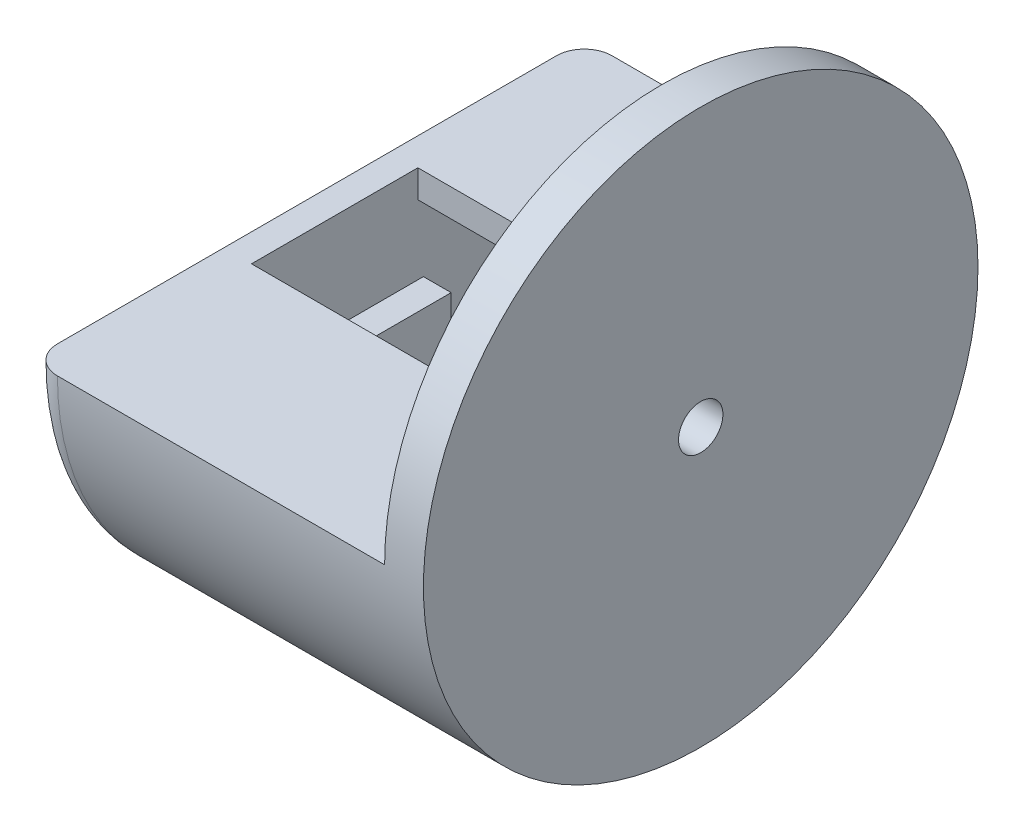
ISO-10303-21;
HEADER;
FILE_DESCRIPTION(('STEP AP214'),'2;1');
FILE_NAME('part.step','',(''),(''),'','','');
FILE_SCHEMA(('AUTOMOTIVE_DESIGN { 1 0 10303 214 1 1 1 1 }'));
ENDSEC;
DATA;
#1=APPLICATION_CONTEXT('core data for automotive mechanical design processes');
#2=APPLICATION_PROTOCOL_DEFINITION('international standard','automotive_design',2000,#1);
#3=PRODUCT_CONTEXT('',#1,'mechanical');
#4=PRODUCT('Part','Part','',(#3));
#5=PRODUCT_RELATED_PRODUCT_CATEGORY('part','',(#4));
#6=PRODUCT_DEFINITION_FORMATION('','',#4);
#7=PRODUCT_DEFINITION_CONTEXT('part definition',#1,'design');
#8=PRODUCT_DEFINITION('design','',#6,#7);
#9=PRODUCT_DEFINITION_SHAPE('','',#8);
#10=(LENGTH_UNIT() NAMED_UNIT(*) SI_UNIT(.MILLI.,.METRE.));
#11=(NAMED_UNIT(*) PLANE_ANGLE_UNIT() SI_UNIT($,.RADIAN.));
#12=(NAMED_UNIT(*) SI_UNIT($,.STERADIAN.) SOLID_ANGLE_UNIT());
#13=UNCERTAINTY_MEASURE_WITH_UNIT(LENGTH_MEASURE(1.E-05),#10,'distance_accuracy_value','');
#14=(GEOMETRIC_REPRESENTATION_CONTEXT(3) GLOBAL_UNCERTAINTY_ASSIGNED_CONTEXT((#13)) GLOBAL_UNIT_ASSIGNED_CONTEXT((#10,
#11,#12)) REPRESENTATION_CONTEXT('',''));
#15=CARTESIAN_POINT('',(0.,0.,0.));
#16=DIRECTION('',(0.,0.,1.));
#17=DIRECTION('',(1.,0.,0.));
#18=AXIS2_PLACEMENT_3D('',#15,#16,#17);
#19=CARTESIAN_POINT('',(-11.,47.5,-10.));
#20=DIRECTION('',(1.,0.,0.));
#21=DIRECTION('',(0.,0.,-1.));
#22=AXIS2_PLACEMENT_3D('',#19,#20,#21);
#23=CYLINDRICAL_SURFACE('',#22,45.);
#24=DIRECTION('',(1.,0.,0.));
#25=VECTOR('',#24,1.);
#26=CARTESIAN_POINT('',(-11.,42.5,34.7213595499958));
#27=LINE('',#26,#25);
#28=CARTESIAN_POINT('',(53.,42.5,34.7213595499958));
#29=VERTEX_POINT('',#28);
#30=CARTESIAN_POINT('',(-6.,42.5,34.7213595499958));
#31=VERTEX_POINT('',#30);
#32=EDGE_CURVE('E187',#29,#31,#27,.F.);
#33=ORIENTED_EDGE('',*,*,#32,.F.);
#34=CARTESIAN_POINT('',(53.,47.5,-10.));
#35=DIRECTION('',(1.,0.,0.));
#36=DIRECTION('',(0.,0.,1.));
#37=AXIS2_PLACEMENT_3D('',#34,#35,#36);
#38=CIRCLE('',#37,45.);
#39=CARTESIAN_POINT('',(53.,3.62517806303939,0.));
#40=VERTEX_POINT('',#39);
#41=EDGE_CURVE('E183',#29,#40,#38,.T.);
#42=ORIENTED_EDGE('',*,*,#41,.T.);
#43=DIRECTION('',(1.,0.,0.));
#44=VECTOR('',#43,1.);
#45=CARTESIAN_POINT('',(-11.,3.62517806303939,0.));
#46=LINE('',#45,#44);
#47=CARTESIAN_POINT('',(0.,3.62517806303939,0.));
#48=VERTEX_POINT('',#47);
#49=EDGE_CURVE('E231',#40,#48,#46,.F.);
#50=ORIENTED_EDGE('',*,*,#49,.T.);
#51=CARTESIAN_POINT('',(0.,47.5,-10.));
#52=DIRECTION('',(1.,0.,0.));
#53=DIRECTION('',(0.,0.,-1.));
#54=AXIS2_PLACEMENT_3D('',#51,#52,#53);
#55=CIRCLE('',#54,45.);
#56=CARTESIAN_POINT('',(0.,3.62517806303939,-20.));
#57=VERTEX_POINT('',#56);
#58=EDGE_CURVE('E227',#48,#57,#55,.T.);
#59=ORIENTED_EDGE('',*,*,#58,.T.);
#60=DIRECTION('',(1.,0.,0.));
#61=VECTOR('',#60,1.);
#62=CARTESIAN_POINT('',(-11.,3.62517806303939,-20.));
#63=LINE('',#62,#61);
#64=CARTESIAN_POINT('',(53.,3.62517806303939,-20.));
#65=VERTEX_POINT('',#64);
#66=EDGE_CURVE('E233',#57,#65,#63,.T.);
#67=ORIENTED_EDGE('',*,*,#66,.T.);
#68=CARTESIAN_POINT('',(53.,42.5,-54.7213595499958));
#69=VERTEX_POINT('',#68);
#70=EDGE_CURVE('E225',#65,#69,#38,.T.);
#71=ORIENTED_EDGE('',*,*,#70,.T.);
#72=DIRECTION('',(1.,0.,0.));
#73=VECTOR('',#72,1.);
#74=CARTESIAN_POINT('',(-11.,42.5,-54.7213595499958));
#75=LINE('',#74,#73);
#76=CARTESIAN_POINT('',(-6.,42.5,-54.7213595499958));
#77=VERTEX_POINT('',#76);
#78=EDGE_CURVE('E206',#77,#69,#75,.T.);
#79=ORIENTED_EDGE('',*,*,#78,.F.);
#80=CARTESIAN_POINT('',(-6.,47.5,-10.));
#81=DIRECTION('',(-1.,0.,0.));
#82=DIRECTION('',(0.,0.,1.));
#83=AXIS2_PLACEMENT_3D('',#80,#81,#82);
#84=CIRCLE('',#83,45.);
#85=EDGE_CURVE('E209',#77,#31,#84,.T.);
#86=ORIENTED_EDGE('',*,*,#85,.T.);
#87=EDGE_LOOP('',(#33,#42,#50,#59,#67,#71,#79,#86));
#88=FACE_BOUND('',#87,.T.);
#89=ADVANCED_FACE('F47',(#88),#23,.F.);
#90=CARTESIAN_POINT('',(53.,0.,0.));
#91=DIRECTION('',(1.,0.,0.));
#92=DIRECTION('',(0.,0.,-1.));
#93=AXIS2_PLACEMENT_3D('',#90,#91,#92);
#94=PLANE('',#93);
#95=CARTESIAN_POINT('',(53.,47.5,-10.));
#96=DIRECTION('',(1.,0.,0.));
#97=DIRECTION('',(0.,0.,-1.));
#98=AXIS2_PLACEMENT_3D('',#95,#96,#97);
#99=CIRCLE('',#98,4.);
#100=CARTESIAN_POINT('',(53.,47.5,-14.));
#101=VERTEX_POINT('',#100);
#102=EDGE_CURVE('E246',#101,#101,#99,.T.);
#103=ORIENTED_EDGE('',*,*,#102,.T.);
#104=EDGE_LOOP('',(#103));
#105=FACE_BOUND('',#104,.T.);
#106=DIRECTION('',(0.,0.,-1.));
#107=VECTOR('',#106,1.);
#108=CARTESIAN_POINT('',(53.,42.5,0.));
#109=LINE('',#108,#107);
#110=CARTESIAN_POINT('',(53.,42.5,5.));
#111=VERTEX_POINT('',#110);
#112=EDGE_CURVE('E166',#29,#111,#109,.T.);
#113=ORIENTED_EDGE('',*,*,#112,.T.);
#114=DIRECTION('',(0.,1.,0.));
#115=VECTOR('',#114,1.);
#116=CARTESIAN_POINT('',(53.,42.5,5.));
#117=LINE('',#116,#115);
#118=CARTESIAN_POINT('',(53.,47.5,5.));
#119=VERTEX_POINT('',#118);
#120=EDGE_CURVE('E172',#111,#119,#117,.T.);
#121=ORIENTED_EDGE('',*,*,#120,.T.);
#122=DIRECTION('',(0.,0.,-1.));
#123=VECTOR('',#122,1.);
#124=CARTESIAN_POINT('',(53.,47.5,35.));
#125=LINE('',#124,#123);
#126=CARTESIAN_POINT('',(53.,47.5,40.));
#127=VERTEX_POINT('',#126);
#128=EDGE_CURVE('E214',#127,#119,#125,.T.);
#129=ORIENTED_EDGE('',*,*,#128,.F.);
#130=CARTESIAN_POINT('',(53.,47.5,-10.));
#131=DIRECTION('',(1.,0.,0.));
#132=DIRECTION('',(0.,0.,-1.));
#133=AXIS2_PLACEMENT_3D('',#130,#131,#132);
#134=CIRCLE('',#133,50.);
#135=CARTESIAN_POINT('',(53.,47.5,-60.));
#136=VERTEX_POINT('',#135);
#137=EDGE_CURVE('E237',#136,#127,#134,.T.);
#138=ORIENTED_EDGE('',*,*,#137,.F.);
#139=DIRECTION('',(0.,0.,-1.));
#140=VECTOR('',#139,1.);
#141=CARTESIAN_POINT('',(53.,47.5,-60.));
#142=LINE('',#141,#140);
#143=CARTESIAN_POINT('',(53.,47.5,-25.));
#144=VERTEX_POINT('',#143);
#145=EDGE_CURVE('E219',#144,#136,#142,.T.);
#146=ORIENTED_EDGE('',*,*,#145,.F.);
#147=DIRECTION('',(0.,1.,0.));
#148=VECTOR('',#147,1.);
#149=CARTESIAN_POINT('',(53.,42.5,-25.));
#150=LINE('',#149,#148);
#151=CARTESIAN_POINT('',(53.,42.5,-25.));
#152=VERTEX_POINT('',#151);
#153=EDGE_CURVE('E201',#152,#144,#150,.T.);
#154=ORIENTED_EDGE('',*,*,#153,.F.);
#155=DIRECTION('',(0.,0.,1.));
#156=VECTOR('',#155,1.);
#157=CARTESIAN_POINT('',(53.,42.5,0.));
#158=LINE('',#157,#156);
#159=EDGE_CURVE('E194',#69,#152,#158,.T.);
#160=ORIENTED_EDGE('',*,*,#159,.F.);
#161=ORIENTED_EDGE('',*,*,#70,.F.);
#162=DIRECTION('',(0.,1.,0.));
#163=VECTOR('',#162,1.);
#164=CARTESIAN_POINT('',(53.,10.,-20.));
#165=LINE('',#164,#163);
#166=CARTESIAN_POINT('',(53.,36.,-20.));
#167=VERTEX_POINT('',#166);
#168=EDGE_CURVE('E239',#65,#167,#165,.T.);
#169=ORIENTED_EDGE('',*,*,#168,.T.);
#170=DIRECTION('',(0.,0.,1.));
#171=VECTOR('',#170,1.);
#172=CARTESIAN_POINT('',(53.,36.,0.));
#173=LINE('',#172,#171);
#174=CARTESIAN_POINT('',(53.,36.,0.));
#175=VERTEX_POINT('',#174);
#176=EDGE_CURVE('E248',#167,#175,#173,.T.);
#177=ORIENTED_EDGE('',*,*,#176,.T.);
#178=DIRECTION('',(0.,-1.,0.));
#179=VECTOR('',#178,1.);
#180=CARTESIAN_POINT('',(53.,10.,0.));
#181=LINE('',#180,#179);
#182=EDGE_CURVE('E241',#175,#40,#181,.T.);
#183=ORIENTED_EDGE('',*,*,#182,.T.);
#184=ORIENTED_EDGE('',*,*,#41,.F.);
#185=EDGE_LOOP('',(#113,#121,#129,#138,#146,#154,#160,#161,#169,#177,#183,#184));
#186=FACE_BOUND('',#185,.T.);
#187=ADVANCED_FACE('F181',(#105,#186),#94,.F.);
#188=CARTESIAN_POINT('',(-6.,47.5,-10.));
#189=DIRECTION('',(-1.,0.,0.));
#190=DIRECTION('',(0.,0.,1.));
#191=AXIS2_PLACEMENT_3D('',#188,#189,#190);
#192=PLANE('',#191);
#193=DIRECTION('',(0.,1.,0.));
#194=VECTOR('',#193,1.);
#195=CARTESIAN_POINT('',(-6.,42.5,5.00000000000002));
#196=LINE('',#195,#194);
#197=CARTESIAN_POINT('',(-6.,42.5,5.00000000000002));
#198=VERTEX_POINT('',#197);
#199=CARTESIAN_POINT('',(-6.,47.5,4.99999999999999));
#200=VERTEX_POINT('',#199);
#201=EDGE_CURVE('E177',#198,#200,#196,.T.);
#202=ORIENTED_EDGE('',*,*,#201,.F.);
#203=DIRECTION('',(0.,0.,-1.));
#204=VECTOR('',#203,1.);
#205=CARTESIAN_POINT('',(-6.,42.5,-10.));
#206=LINE('',#205,#204);
#207=EDGE_CURVE('E11',#31,#198,#206,.T.);
#208=ORIENTED_EDGE('',*,*,#207,.F.);
#209=ORIENTED_EDGE('',*,*,#85,.F.);
#210=DIRECTION('',(0.,0.,-1.));
#211=VECTOR('',#210,1.);
#212=CARTESIAN_POINT('',(-6.,42.5,0.));
#213=LINE('',#212,#211);
#214=CARTESIAN_POINT('',(-6.,42.5,-25.));
#215=VERTEX_POINT('',#214);
#216=EDGE_CURVE('E195',#215,#77,#213,.T.);
#217=ORIENTED_EDGE('',*,*,#216,.F.);
#218=DIRECTION('',(0.,1.,0.));
#219=VECTOR('',#218,1.);
#220=CARTESIAN_POINT('',(-6.,42.5,-25.));
#221=LINE('',#220,#219);
#222=CARTESIAN_POINT('',(-6.,47.5,-25.));
#223=VERTEX_POINT('',#222);
#224=EDGE_CURVE('E199',#215,#223,#221,.T.);
#225=ORIENTED_EDGE('',*,*,#224,.T.);
#226=DIRECTION('',(0.,0.,-1.));
#227=VECTOR('',#226,1.);
#228=CARTESIAN_POINT('',(-6.,47.5,-55.));
#229=LINE('',#228,#227);
#230=EDGE_CURVE('E213',#200,#223,#229,.T.);
#231=ORIENTED_EDGE('',*,*,#230,.F.);
#232=EDGE_LOOP('',(#202,#208,#209,#217,#225,#231));
#233=FACE_BOUND('',#232,.T.);
#234=ADVANCED_FACE('F335',(#233),#192,.F.);
#235=CARTESIAN_POINT('',(0.,10.,0.));
#236=DIRECTION('',(0.,0.,-1.));
#237=DIRECTION('',(-1.,0.,0.));
#238=AXIS2_PLACEMENT_3D('',#235,#236,#237);
#239=PLANE('',#238);
#240=ORIENTED_EDGE('',*,*,#49,.F.);
#241=ORIENTED_EDGE('',*,*,#182,.F.);
#242=DIRECTION('',(1.,0.,0.));
#243=VECTOR('',#242,1.);
#244=CARTESIAN_POINT('',(50.,36.,0.));
#245=LINE('',#244,#243);
#246=CARTESIAN_POINT('',(45.,36.,0.));
#247=VERTEX_POINT('',#246);
#248=EDGE_CURVE('E257',#247,#175,#245,.T.);
#249=ORIENTED_EDGE('',*,*,#248,.F.);
#250=DIRECTION('',(0.,-1.,0.));
#251=VECTOR('',#250,1.);
#252=CARTESIAN_POINT('',(45.,36.,0.));
#253=LINE('',#252,#251);
#254=CARTESIAN_POINT('',(45.,10.,0.));
#255=VERTEX_POINT('',#254);
#256=EDGE_CURVE('E260',#247,#255,#253,.T.);
#257=ORIENTED_EDGE('',*,*,#256,.T.);
#258=DIRECTION('',(1.,0.,0.));
#259=VECTOR('',#258,1.);
#260=CARTESIAN_POINT('',(0.,10.,0.));
#261=LINE('',#260,#259);
#262=CARTESIAN_POINT('',(5.,10.,0.));
#263=VERTEX_POINT('',#262);
#264=EDGE_CURVE('E289',#263,#255,#261,.T.);
#265=ORIENTED_EDGE('',*,*,#264,.F.);
#266=DIRECTION('',(0.,-1.,0.));
#267=VECTOR('',#266,1.);
#268=CARTESIAN_POINT('',(5.,36.,0.));
#269=LINE('',#268,#267);
#270=CARTESIAN_POINT('',(5.,36.,0.));
#271=VERTEX_POINT('',#270);
#272=EDGE_CURVE('E288',#271,#263,#269,.T.);
#273=ORIENTED_EDGE('',*,*,#272,.F.);
#274=DIRECTION('',(1.,0.,0.));
#275=VECTOR('',#274,1.);
#276=CARTESIAN_POINT('',(0.,36.,0.));
#277=LINE('',#276,#275);
#278=CARTESIAN_POINT('',(0.,36.,0.));
#279=VERTEX_POINT('',#278);
#280=EDGE_CURVE('E273',#279,#271,#277,.T.);
#281=ORIENTED_EDGE('',*,*,#280,.F.);
#282=DIRECTION('',(0.,-1.,0.));
#283=VECTOR('',#282,1.);
#284=CARTESIAN_POINT('',(0.,10.,0.));
#285=LINE('',#284,#283);
#286=EDGE_CURVE('E298',#279,#48,#285,.T.);
#287=ORIENTED_EDGE('',*,*,#286,.T.);
#288=EDGE_LOOP('',(#240,#241,#249,#257,#265,#273,#281,#287));
#289=FACE_BOUND('',#288,.T.);
#290=ADVANCED_FACE('F369',(#289),#239,.F.);
#291=CARTESIAN_POINT('',(0.,10.,-20.));
#292=DIRECTION('',(0.,0.,1.));
#293=DIRECTION('',(1.,0.,0.));
#294=AXIS2_PLACEMENT_3D('',#291,#292,#293);
#295=PLANE('',#294);
#296=ORIENTED_EDGE('',*,*,#66,.F.);
#297=DIRECTION('',(0.,-1.,0.));
#298=VECTOR('',#297,1.);
#299=CARTESIAN_POINT('',(0.,10.,-20.));
#300=LINE('',#299,#298);
#301=CARTESIAN_POINT('',(0.,36.,-20.));
#302=VERTEX_POINT('',#301);
#303=EDGE_CURVE('E291',#302,#57,#300,.T.);
#304=ORIENTED_EDGE('',*,*,#303,.F.);
#305=DIRECTION('',(-1.,0.,0.));
#306=VECTOR('',#305,1.);
#307=CARTESIAN_POINT('',(0.,36.,-20.));
#308=LINE('',#307,#306);
#309=CARTESIAN_POINT('',(5.,36.,-20.));
#310=VERTEX_POINT('',#309);
#311=EDGE_CURVE('E279',#310,#302,#308,.T.);
#312=ORIENTED_EDGE('',*,*,#311,.F.);
#313=DIRECTION('',(0.,-1.,0.));
#314=VECTOR('',#313,1.);
#315=CARTESIAN_POINT('',(5.,36.,-20.));
#316=LINE('',#315,#314);
#317=CARTESIAN_POINT('',(5.,10.,-20.));
#318=VERTEX_POINT('',#317);
#319=EDGE_CURVE('E283',#310,#318,#316,.T.);
#320=ORIENTED_EDGE('',*,*,#319,.T.);
#321=DIRECTION('',(-1.,0.,0.));
#322=VECTOR('',#321,1.);
#323=CARTESIAN_POINT('',(0.,10.,-20.));
#324=LINE('',#323,#322);
#325=CARTESIAN_POINT('',(45.,10.,-20.));
#326=VERTEX_POINT('',#325);
#327=EDGE_CURVE('E292',#326,#318,#324,.T.);
#328=ORIENTED_EDGE('',*,*,#327,.F.);
#329=DIRECTION('',(0.,-1.,0.));
#330=VECTOR('',#329,1.);
#331=CARTESIAN_POINT('',(45.,36.,-20.));
#332=LINE('',#331,#330);
#333=CARTESIAN_POINT('',(45.,36.,-20.));
#334=VERTEX_POINT('',#333);
#335=EDGE_CURVE('E252',#334,#326,#332,.T.);
#336=ORIENTED_EDGE('',*,*,#335,.F.);
#337=DIRECTION('',(-1.,0.,0.));
#338=VECTOR('',#337,1.);
#339=CARTESIAN_POINT('',(50.,36.,-20.));
#340=LINE('',#339,#338);
#341=EDGE_CURVE('E264',#167,#334,#340,.T.);
#342=ORIENTED_EDGE('',*,*,#341,.F.);
#343=ORIENTED_EDGE('',*,*,#168,.F.);
#344=EDGE_LOOP('',(#296,#304,#312,#320,#328,#336,#342,#343));
#345=FACE_BOUND('',#344,.T.);
#346=ADVANCED_FACE('F368',(#345),#295,.F.);
#347=CARTESIAN_POINT('',(0.,10.,0.));
#348=DIRECTION('',(1.,0.,0.));
#349=DIRECTION('',(0.,0.,-1.));
#350=AXIS2_PLACEMENT_3D('',#347,#348,#349);
#351=PLANE('',#350);
#352=ORIENTED_EDGE('',*,*,#58,.F.);
#353=ORIENTED_EDGE('',*,*,#286,.F.);
#354=DIRECTION('',(0.,0.,1.));
#355=VECTOR('',#354,1.);
#356=CARTESIAN_POINT('',(0.,36.,-20.));
#357=LINE('',#356,#355);
#358=EDGE_CURVE('E271',#302,#279,#357,.T.);
#359=ORIENTED_EDGE('',*,*,#358,.F.);
#360=ORIENTED_EDGE('',*,*,#303,.T.);
#361=EDGE_LOOP('',(#352,#353,#359,#360));
#362=FACE_BOUND('',#361,.T.);
#363=ADVANCED_FACE('F352',(#362),#351,.F.);
#364=CARTESIAN_POINT('',(0.,36.,0.));
#365=DIRECTION('',(0.,-1.,0.));
#366=DIRECTION('',(0.,0.,-1.));
#367=AXIS2_PLACEMENT_3D('',#364,#365,#366);
#368=PLANE('',#367);
#369=ORIENTED_EDGE('',*,*,#176,.F.);
#370=ORIENTED_EDGE('',*,*,#341,.T.);
#371=DIRECTION('',(0.,0.,1.));
#372=VECTOR('',#371,1.);
#373=CARTESIAN_POINT('',(45.,36.,-20.));
#374=LINE('',#373,#372);
#375=EDGE_CURVE('E268',#334,#247,#374,.T.);
#376=ORIENTED_EDGE('',*,*,#375,.T.);
#377=ORIENTED_EDGE('',*,*,#248,.T.);
#378=EDGE_LOOP('',(#369,#370,#376,#377));
#379=FACE_BOUND('',#378,.T.);
#380=ADVANCED_FACE('F348',(#379),#368,.F.);
#381=CARTESIAN_POINT('',(0.,10.,0.));
#382=DIRECTION('',(0.,-1.,0.));
#383=DIRECTION('',(0.,0.,-1.));
#384=AXIS2_PLACEMENT_3D('',#381,#382,#383);
#385=PLANE('',#384);
#386=DIRECTION('',(0.,0.,1.));
#387=VECTOR('',#386,1.);
#388=CARTESIAN_POINT('',(45.,10.,-20.));
#389=LINE('',#388,#387);
#390=EDGE_CURVE('E261',#326,#255,#389,.T.);
#391=ORIENTED_EDGE('',*,*,#390,.F.);
#392=ORIENTED_EDGE('',*,*,#327,.T.);
#393=DIRECTION('',(0.,0.,-1.));
#394=VECTOR('',#393,1.);
#395=CARTESIAN_POINT('',(5.,10.,-20.));
#396=LINE('',#395,#394);
#397=EDGE_CURVE('E262',#263,#318,#396,.T.);
#398=ORIENTED_EDGE('',*,*,#397,.F.);
#399=ORIENTED_EDGE('',*,*,#264,.T.);
#400=EDGE_LOOP('',(#391,#392,#398,#399));
#401=FACE_BOUND('',#400,.T.);
#402=ADVANCED_FACE('F351',(#401),#385,.F.);
#403=CARTESIAN_POINT('',(5.,36.,-20.));
#404=DIRECTION('',(-1.,0.,0.));
#405=DIRECTION('',(0.,0.,1.));
#406=AXIS2_PLACEMENT_3D('',#403,#404,#405);
#407=PLANE('',#406);
#408=ORIENTED_EDGE('',*,*,#397,.T.);
#409=ORIENTED_EDGE('',*,*,#319,.F.);
#410=DIRECTION('',(0.,0.,-1.));
#411=VECTOR('',#410,1.);
#412=CARTESIAN_POINT('',(5.,36.,-20.));
#413=LINE('',#412,#411);
#414=EDGE_CURVE('E277',#271,#310,#413,.T.);
#415=ORIENTED_EDGE('',*,*,#414,.F.);
#416=ORIENTED_EDGE('',*,*,#272,.T.);
#417=EDGE_LOOP('',(#408,#409,#415,#416));
#418=FACE_BOUND('',#417,.T.);
#419=ADVANCED_FACE('F359',(#418),#407,.F.);
#420=CARTESIAN_POINT('',(0.,36.,0.));
#421=DIRECTION('',(0.,1.,0.));
#422=DIRECTION('',(0.,0.,1.));
#423=AXIS2_PLACEMENT_3D('',#420,#421,#422);
#424=PLANE('',#423);
#425=ORIENTED_EDGE('',*,*,#358,.T.);
#426=ORIENTED_EDGE('',*,*,#280,.T.);
#427=ORIENTED_EDGE('',*,*,#414,.T.);
#428=ORIENTED_EDGE('',*,*,#311,.T.);
#429=EDGE_LOOP('',(#425,#426,#427,#428));
#430=FACE_BOUND('',#429,.T.);
#431=ADVANCED_FACE('F346',(#430),#424,.T.);
#432=CARTESIAN_POINT('',(45.,36.,-20.));
#433=DIRECTION('',(1.,0.,0.));
#434=DIRECTION('',(0.,0.,-1.));
#435=AXIS2_PLACEMENT_3D('',#432,#433,#434);
#436=PLANE('',#435);
#437=ORIENTED_EDGE('',*,*,#390,.T.);
#438=ORIENTED_EDGE('',*,*,#256,.F.);
#439=ORIENTED_EDGE('',*,*,#375,.F.);
#440=ORIENTED_EDGE('',*,*,#335,.T.);
#441=EDGE_LOOP('',(#437,#438,#439,#440));
#442=FACE_BOUND('',#441,.T.);
#443=ADVANCED_FACE('F344',(#442),#436,.F.);
#444=CARTESIAN_POINT('',(60.,36.,0.));
#445=DIRECTION('',(1.,0.,0.));
#446=DIRECTION('',(0.,0.,-1.));
#447=AXIS2_PLACEMENT_3D('',#444,#445,#446);
#448=PLANE('',#447);
#449=CARTESIAN_POINT('',(60.,47.5,-10.));
#450=DIRECTION('',(1.,0.,0.));
#451=DIRECTION('',(0.,0.,-1.));
#452=AXIS2_PLACEMENT_3D('',#449,#450,#451);
#453=CIRCLE('',#452,4.);
#454=CARTESIAN_POINT('',(60.,47.5,-14.));
#455=VERTEX_POINT('',#454);
#456=EDGE_CURVE('E244',#455,#455,#453,.T.);
#457=ORIENTED_EDGE('',*,*,#456,.F.);
#458=EDGE_LOOP('',(#457));
#459=FACE_BOUND('',#458,.T.);
#460=CARTESIAN_POINT('',(60.,47.5,-10.));
#461=DIRECTION('',(1.,0.,0.));
#462=DIRECTION('',(0.,0.,-1.));
#463=AXIS2_PLACEMENT_3D('',#460,#461,#462);
#464=CIRCLE('',#463,50.);
#465=CARTESIAN_POINT('',(60.,47.5,-60.));
#466=VERTEX_POINT('',#465);
#467=EDGE_CURVE('E232',#466,#466,#464,.T.);
#468=ORIENTED_EDGE('',*,*,#467,.T.);
#469=EDGE_LOOP('',(#468));
#470=FACE_BOUND('',#469,.T.);
#471=ADVANCED_FACE('F339',(#459,#470),#448,.T.);
#472=CARTESIAN_POINT('',(53.,47.5,-10.));
#473=DIRECTION('',(1.,0.,0.));
#474=DIRECTION('',(0.,0.,-1.));
#475=AXIS2_PLACEMENT_3D('',#472,#473,#474);
#476=CYLINDRICAL_SURFACE('',#475,4.);
#477=ORIENTED_EDGE('',*,*,#102,.F.);
#478=EDGE_LOOP('',(#477));
#479=FACE_BOUND('',#478,.T.);
#480=ORIENTED_EDGE('',*,*,#456,.T.);
#481=EDGE_LOOP('',(#480));
#482=FACE_BOUND('',#481,.T.);
#483=ADVANCED_FACE('F338',(#479,#482),#476,.F.);
#484=CARTESIAN_POINT('',(53.,47.5,-10.));
#485=DIRECTION('',(1.,0.,0.));
#486=DIRECTION('',(0.,0.,-1.));
#487=AXIS2_PLACEMENT_3D('',#484,#485,#486);
#488=CYLINDRICAL_SURFACE('',#487,50.);
#489=DIRECTION('',(1.,0.,0.));
#490=VECTOR('',#489,1.);
#491=CARTESIAN_POINT('',(-11.,47.5,40.));
#492=LINE('',#491,#490);
#493=CARTESIAN_POINT('',(-6.,47.5,40.));
#494=VERTEX_POINT('',#493);
#495=EDGE_CURVE('E230',#494,#127,#492,.T.);
#496=ORIENTED_EDGE('',*,*,#495,.F.);
#497=CARTESIAN_POINT('',(-6.,47.5,-10.));
#498=DIRECTION('',(-1.,0.,0.));
#499=DIRECTION('',(0.,0.,1.));
#500=AXIS2_PLACEMENT_3D('',#497,#498,#499);
#501=CIRCLE('',#500,50.);
#502=CARTESIAN_POINT('',(-6.,47.5,-60.));
#503=VERTEX_POINT('',#502);
#504=EDGE_CURVE('E60',#494,#503,#501,.F.);
#505=ORIENTED_EDGE('',*,*,#504,.T.);
#506=DIRECTION('',(1.,0.,0.));
#507=VECTOR('',#506,1.);
#508=CARTESIAN_POINT('',(-11.,47.5,-60.));
#509=LINE('',#508,#507);
#510=EDGE_CURVE('E218',#503,#136,#509,.T.);
#511=ORIENTED_EDGE('',*,*,#510,.T.);
#512=ORIENTED_EDGE('',*,*,#137,.T.);
#513=EDGE_LOOP('',(#496,#505,#511,#512));
#514=FACE_BOUND('',#513,.T.);
#515=ORIENTED_EDGE('',*,*,#467,.F.);
#516=EDGE_LOOP('',(#515));
#517=FACE_BOUND('',#516,.T.);
#518=ADVANCED_FACE('F307',(#514,#517),#488,.T.);
#519=CARTESIAN_POINT('',(-11.,47.5,35.));
#520=DIRECTION('',(0.,-1.,0.));
#521=DIRECTION('',(0.,0.,-1.));
#522=AXIS2_PLACEMENT_3D('',#519,#520,#521);
#523=PLANE('',#522);
#524=ORIENTED_EDGE('',*,*,#128,.T.);
#525=DIRECTION('',(1.,0.,0.));
#526=VECTOR('',#525,1.);
#527=CARTESIAN_POINT('',(0.,47.5,5.00000000000003));
#528=LINE('',#527,#526);
#529=EDGE_CURVE('E62',#200,#119,#528,.T.);
#530=ORIENTED_EDGE('',*,*,#529,.F.);
#531=ORIENTED_EDGE('',*,*,#230,.T.);
#532=DIRECTION('',(1.,0.,0.));
#533=VECTOR('',#532,1.);
#534=CARTESIAN_POINT('',(0.,47.5,-25.));
#535=LINE('',#534,#533);
#536=EDGE_CURVE('E192',#223,#144,#535,.T.);
#537=ORIENTED_EDGE('',*,*,#536,.T.);
#538=ORIENTED_EDGE('',*,*,#145,.T.);
#539=ORIENTED_EDGE('',*,*,#510,.F.);
#540=CARTESIAN_POINT('',(-6.,47.5,-55.));
#541=DIRECTION('',(0.,-1.,0.));
#542=DIRECTION('',(0.,0.,-1.));
#543=AXIS2_PLACEMENT_3D('',#540,#541,#542);
#544=CIRCLE('',#543,5.);
#545=CARTESIAN_POINT('',(-11.,47.5,-55.));
#546=VERTEX_POINT('',#545);
#547=EDGE_CURVE('E302',#503,#546,#544,.F.);
#548=ORIENTED_EDGE('',*,*,#547,.T.);
#549=DIRECTION('',(0.,0.,-1.));
#550=VECTOR('',#549,1.);
#551=CARTESIAN_POINT('',(-11.,47.5,35.));
#552=LINE('',#551,#550);
#553=CARTESIAN_POINT('',(-11.,47.5,35.));
#554=VERTEX_POINT('',#553);
#555=EDGE_CURVE('E216',#554,#546,#552,.T.);
#556=ORIENTED_EDGE('',*,*,#555,.F.);
#557=CARTESIAN_POINT('',(-6.,47.5,35.));
#558=DIRECTION('',(0.,-1.,0.));
#559=DIRECTION('',(0.,0.,-1.));
#560=AXIS2_PLACEMENT_3D('',#557,#558,#559);
#561=CIRCLE('',#560,5.);
#562=EDGE_CURVE('E72',#554,#494,#561,.F.);
#563=ORIENTED_EDGE('',*,*,#562,.T.);
#564=ORIENTED_EDGE('',*,*,#495,.T.);
#565=EDGE_LOOP('',(#524,#530,#531,#537,#538,#539,#548,#556,#563,#564));
#566=FACE_BOUND('',#565,.T.);
#567=ADVANCED_FACE('F313',(#566),#523,.F.);
#568=CARTESIAN_POINT('',(-11.,47.5,-10.));
#569=DIRECTION('',(-1.,0.,0.));
#570=DIRECTION('',(0.,0.,1.));
#571=AXIS2_PLACEMENT_3D('',#568,#569,#570);
#572=PLANE('',#571);
#573=ORIENTED_EDGE('',*,*,#555,.T.);
#574=CARTESIAN_POINT('',(-11.,47.5,-10.));
#575=DIRECTION('',(-1.,0.,0.));
#576=DIRECTION('',(0.,0.,1.));
#577=AXIS2_PLACEMENT_3D('',#574,#575,#576);
#578=CIRCLE('',#577,45.);
#579=EDGE_CURVE('E297',#546,#554,#578,.T.);
#580=ORIENTED_EDGE('',*,*,#579,.T.);
#581=EDGE_LOOP('',(#573,#580));
#582=FACE_BOUND('',#581,.T.);
#583=ADVANCED_FACE('F312',(#582),#572,.T.);
#584=CARTESIAN_POINT('',(-6.,47.5,-10.));
#585=DIRECTION('',(-1.,0.,0.));
#586=DIRECTION('',(0.,0.,1.));
#587=AXIS2_PLACEMENT_3D('',#584,#585,#586);
#588=TOROIDAL_SURFACE('',#587,45.,5.);
#589=ORIENTED_EDGE('',*,*,#547,.F.);
#590=ORIENTED_EDGE('',*,*,#504,.F.);
#591=ORIENTED_EDGE('',*,*,#562,.F.);
#592=ORIENTED_EDGE('',*,*,#579,.F.);
#593=EDGE_LOOP('',(#589,#590,#591,#592));
#594=FACE_BOUND('',#593,.T.);
#595=ADVANCED_FACE('F51',(#594),#588,.T.);
#596=CARTESIAN_POINT('',(0.,42.5,0.));
#597=DIRECTION('',(0.,1.,0.));
#598=DIRECTION('',(0.,0.,1.));
#599=AXIS2_PLACEMENT_3D('',#596,#597,#598);
#600=PLANE('',#599);
#601=ORIENTED_EDGE('',*,*,#216,.T.);
#602=ORIENTED_EDGE('',*,*,#78,.T.);
#603=ORIENTED_EDGE('',*,*,#159,.T.);
#604=DIRECTION('',(1.,0.,0.));
#605=VECTOR('',#604,1.);
#606=CARTESIAN_POINT('',(0.,42.5,-25.));
#607=LINE('',#606,#605);
#608=EDGE_CURVE('E197',#215,#152,#607,.T.);
#609=ORIENTED_EDGE('',*,*,#608,.F.);
#610=EDGE_LOOP('',(#601,#602,#603,#609));
#611=FACE_BOUND('',#610,.T.);
#612=ADVANCED_FACE('F325',(#611),#600,.F.);
#613=CARTESIAN_POINT('',(0.,42.5,-25.));
#614=DIRECTION('',(0.,0.,1.));
#615=DIRECTION('',(1.,0.,0.));
#616=AXIS2_PLACEMENT_3D('',#613,#614,#615);
#617=PLANE('',#616);
#618=ORIENTED_EDGE('',*,*,#536,.F.);
#619=ORIENTED_EDGE('',*,*,#224,.F.);
#620=ORIENTED_EDGE('',*,*,#608,.T.);
#621=ORIENTED_EDGE('',*,*,#153,.T.);
#622=EDGE_LOOP('',(#618,#619,#620,#621));
#623=FACE_BOUND('',#622,.T.);
#624=ADVANCED_FACE('F397',(#623),#617,.T.);
#625=CARTESIAN_POINT('',(0.,42.5,0.));
#626=DIRECTION('',(0.,1.,0.));
#627=DIRECTION('',(0.,0.,1.));
#628=AXIS2_PLACEMENT_3D('',#625,#626,#627);
#629=PLANE('',#628);
#630=ORIENTED_EDGE('',*,*,#112,.F.);
#631=ORIENTED_EDGE('',*,*,#32,.T.);
#632=ORIENTED_EDGE('',*,*,#207,.T.);
#633=DIRECTION('',(1.,0.,0.));
#634=VECTOR('',#633,1.);
#635=CARTESIAN_POINT('',(0.,42.5,5.00000000000003));
#636=LINE('',#635,#634);
#637=EDGE_CURVE('E164',#198,#111,#636,.T.);
#638=ORIENTED_EDGE('',*,*,#637,.T.);
#639=EDGE_LOOP('',(#630,#631,#632,#638));
#640=FACE_BOUND('',#639,.T.);
#641=ADVANCED_FACE('F170',(#640),#629,.F.);
#642=CARTESIAN_POINT('',(0.,42.5,5.00000000000003));
#643=DIRECTION('',(0.,0.,1.));
#644=DIRECTION('',(1.,0.,0.));
#645=AXIS2_PLACEMENT_3D('',#642,#643,#644);
#646=PLANE('',#645);
#647=ORIENTED_EDGE('',*,*,#529,.T.);
#648=ORIENTED_EDGE('',*,*,#120,.F.);
#649=ORIENTED_EDGE('',*,*,#637,.F.);
#650=ORIENTED_EDGE('',*,*,#201,.T.);
#651=EDGE_LOOP('',(#647,#648,#649,#650));
#652=FACE_BOUND('',#651,.T.);
#653=ADVANCED_FACE('F180',(#652),#646,.F.);
#654=CLOSED_SHELL('',(#89,#187,#234,#290,#346,#363,#380,#402,#419,#431,#443,#471,#483,#518,#567,
#583,#595,#612,#624,#641,#653));
#655=MANIFOLD_SOLID_BREP('B2',#654);
#656=ADVANCED_BREP_SHAPE_REPRESENTATION('',(#18,#655),#14);
#657=SHAPE_DEFINITION_REPRESENTATION(#9,#656);
ENDSEC;
END-ISO-10303-21;
